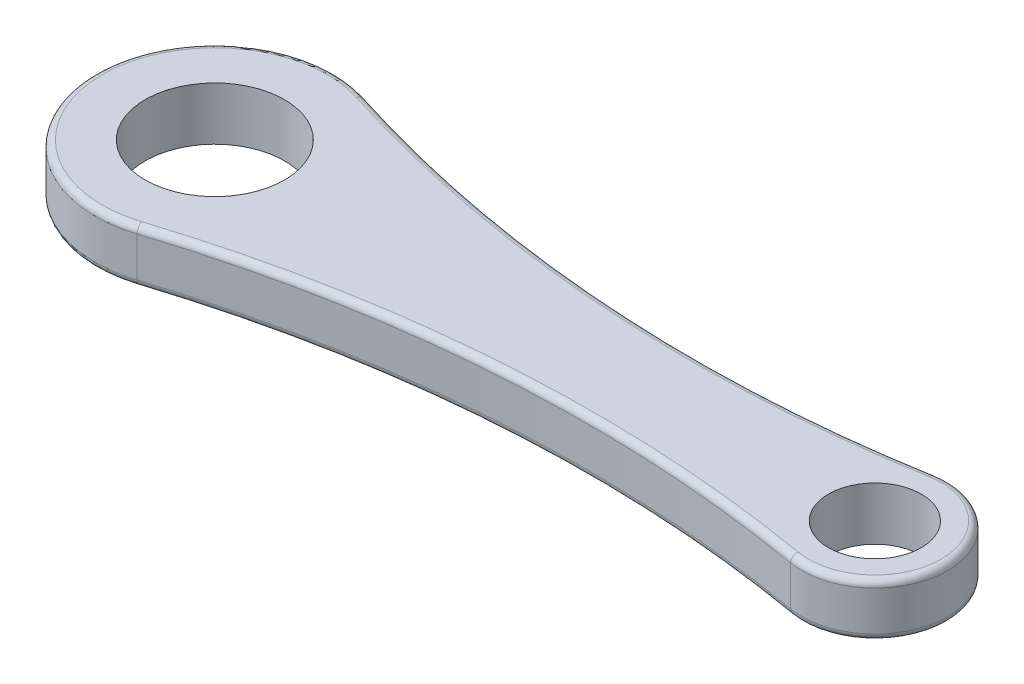
ISO-10303-21;
HEADER;
FILE_DESCRIPTION(('STEP AP214'),'2;1');
FILE_NAME('part.step','',(''),(''),'','','');
FILE_SCHEMA(('AUTOMOTIVE_DESIGN { 1 0 10303 214 1 1 1 1 }'));
ENDSEC;
DATA;
#1=APPLICATION_CONTEXT('core data for automotive mechanical design processes');
#2=APPLICATION_PROTOCOL_DEFINITION('international standard','automotive_design',2000,#1);
#3=PRODUCT_CONTEXT('',#1,'mechanical');
#4=PRODUCT('Part','Part','',(#3));
#5=PRODUCT_RELATED_PRODUCT_CATEGORY('part','',(#4));
#6=PRODUCT_DEFINITION_FORMATION('','',#4);
#7=PRODUCT_DEFINITION_CONTEXT('part definition',#1,'design');
#8=PRODUCT_DEFINITION('design','',#6,#7);
#9=PRODUCT_DEFINITION_SHAPE('','',#8);
#10=(LENGTH_UNIT() NAMED_UNIT(*) SI_UNIT(.MILLI.,.METRE.));
#11=(NAMED_UNIT(*) PLANE_ANGLE_UNIT() SI_UNIT($,.RADIAN.));
#12=(NAMED_UNIT(*) SI_UNIT($,.STERADIAN.) SOLID_ANGLE_UNIT());
#13=UNCERTAINTY_MEASURE_WITH_UNIT(LENGTH_MEASURE(1.E-05),#10,'distance_accuracy_value','');
#14=(GEOMETRIC_REPRESENTATION_CONTEXT(3) GLOBAL_UNCERTAINTY_ASSIGNED_CONTEXT((#13)) GLOBAL_UNIT_ASSIGNED_CONTEXT((#10,
#11,#12)) REPRESENTATION_CONTEXT('',''));
#15=CARTESIAN_POINT('',(0.,0.,0.));
#16=DIRECTION('',(0.,0.,1.));
#17=DIRECTION('',(1.,0.,0.));
#18=AXIS2_PLACEMENT_3D('',#15,#16,#17);
#19=CARTESIAN_POINT('',(40.9952282774071,4.00000000000001,-50.7223519431426));
#20=DIRECTION('',(0.,1.,0.));
#21=DIRECTION('',(0.,0.,1.));
#22=AXIS2_PLACEMENT_3D('',#19,#20,#21);
#23=PLANE('',#22);
#24=CARTESIAN_POINT('',(32.2404565548141,3.99999999999999,-101.444703886285));
#25=DIRECTION('',(0.,1.,0.));
#26=DIRECTION('',(0.,0.,1.));
#27=AXIS2_PLACEMENT_3D('',#24,#25,#26);
#28=CIRCLE('',#27,97.9447038862851);
#29=CARTESIAN_POINT('',(48.8995656024944,3.99999999999995,-4.92714535360375));
#30=VERTEX_POINT('',#29);
#31=CARTESIAN_POINT('',(2.5745187004201,4.00000000000001,-8.10073166209001));
#32=VERTEX_POINT('',#31);
#33=EDGE_CURVE('E51',#30,#32,#28,.F.);
#34=ORIENTED_EDGE('',*,*,#33,.T.);
#35=CARTESIAN_POINT('',(0.,4.00000000000002,0.));
#36=DIRECTION('',(0.,1.,0.));
#37=DIRECTION('',(0.,0.,1.));
#38=AXIS2_PLACEMENT_3D('',#35,#36,#37);
#39=CIRCLE('',#38,8.49999999999999);
#40=CARTESIAN_POINT('',(2.57451870042005,4.,8.10073166209));
#41=VERTEX_POINT('',#40);
#42=EDGE_CURVE('E110',#32,#41,#39,.T.);
#43=ORIENTED_EDGE('',*,*,#42,.T.);
#44=CARTESIAN_POINT('',(32.2404565548141,4.00000000000003,101.444703886285));
#45=DIRECTION('',(0.,1.,0.));
#46=DIRECTION('',(0.,0.,1.));
#47=AXIS2_PLACEMENT_3D('',#44,#45,#46);
#48=CIRCLE('',#47,97.9447038862851);
#49=CARTESIAN_POINT('',(48.8995656024944,3.99999999999999,4.92714535360378));
#50=VERTEX_POINT('',#49);
#51=EDGE_CURVE('E133',#41,#50,#48,.F.);
#52=ORIENTED_EDGE('',*,*,#51,.T.);
#53=CARTESIAN_POINT('',(49.75,4.,0.));
#54=DIRECTION('',(0.,1.,0.));
#55=DIRECTION('',(0.,0.,1.));
#56=AXIS2_PLACEMENT_3D('',#53,#54,#55);
#57=CIRCLE('',#56,4.99999999999999);
#58=EDGE_CURVE('E56',#50,#30,#57,.T.);
#59=ORIENTED_EDGE('',*,*,#58,.T.);
#60=EDGE_LOOP('',(#34,#43,#52,#59));
#61=FACE_BOUND('',#60,.T.);
#62=CARTESIAN_POINT('',(0.,4.00000000000002,0.));
#63=DIRECTION('',(0.,1.,0.));
#64=DIRECTION('',(0.,0.,1.));
#65=AXIS2_PLACEMENT_3D('',#62,#63,#64);
#66=CIRCLE('',#65,5.25);
#67=CARTESIAN_POINT('',(0.,4.00000000000002,5.24999999999999));
#68=VERTEX_POINT('',#67);
#69=EDGE_CURVE('E170',#68,#68,#66,.T.);
#70=ORIENTED_EDGE('',*,*,#69,.F.);
#71=EDGE_LOOP('',(#70));
#72=FACE_BOUND('',#71,.T.);
#73=CARTESIAN_POINT('',(49.75,4.,0.));
#74=DIRECTION('',(0.,1.,0.));
#75=DIRECTION('',(0.,0.,1.));
#76=AXIS2_PLACEMENT_3D('',#73,#74,#75);
#77=CIRCLE('',#76,3.5);
#78=CARTESIAN_POINT('',(49.75,4.,3.5));
#79=VERTEX_POINT('',#78);
#80=EDGE_CURVE('E162',#79,#79,#77,.T.);
#81=ORIENTED_EDGE('',*,*,#80,.F.);
#82=EDGE_LOOP('',(#81));
#83=FACE_BOUND('',#82,.T.);
#84=ADVANCED_FACE('F34',(#61,#72,#83),#23,.T.);
#85=CARTESIAN_POINT('',(40.9952282774071,0.,-50.7223519431426));
#86=DIRECTION('',(0.,1.,0.));
#87=DIRECTION('',(0.,0.,1.));
#88=AXIS2_PLACEMENT_3D('',#85,#86,#87);
#89=PLANE('',#88);
#90=CARTESIAN_POINT('',(32.240456554814,0.,101.444703886285));
#91=DIRECTION('',(0.,1.,0.));
#92=DIRECTION('',(0.,0.,1.));
#93=AXIS2_PLACEMENT_3D('',#90,#91,#92);
#94=CIRCLE('',#93,97.9447038862851);
#95=CARTESIAN_POINT('',(48.8995656024944,0.,4.92714535360375));
#96=VERTEX_POINT('',#95);
#97=CARTESIAN_POINT('',(2.57451870042005,0.,8.10073166208999));
#98=VERTEX_POINT('',#97);
#99=EDGE_CURVE('E181',#96,#98,#94,.T.);
#100=ORIENTED_EDGE('',*,*,#99,.T.);
#101=CARTESIAN_POINT('',(0.,0.,0.));
#102=DIRECTION('',(0.,1.,0.));
#103=DIRECTION('',(0.,0.,1.));
#104=AXIS2_PLACEMENT_3D('',#101,#102,#103);
#105=CIRCLE('',#104,8.49999999999999);
#106=CARTESIAN_POINT('',(2.57451870042007,0.,-8.10073166208999));
#107=VERTEX_POINT('',#106);
#108=EDGE_CURVE('E187',#98,#107,#105,.F.);
#109=ORIENTED_EDGE('',*,*,#108,.T.);
#110=CARTESIAN_POINT('',(32.2404565548141,0.,-101.444703886285));
#111=DIRECTION('',(0.,1.,0.));
#112=DIRECTION('',(0.,0.,1.));
#113=AXIS2_PLACEMENT_3D('',#110,#111,#112);
#114=CIRCLE('',#113,97.9447038862851);
#115=CARTESIAN_POINT('',(48.8995656024944,0.,-4.92714535360379));
#116=VERTEX_POINT('',#115);
#117=EDGE_CURVE('E185',#107,#116,#114,.T.);
#118=ORIENTED_EDGE('',*,*,#117,.T.);
#119=CARTESIAN_POINT('',(49.75,0.,0.));
#120=DIRECTION('',(0.,1.,0.));
#121=DIRECTION('',(0.,0.,1.));
#122=AXIS2_PLACEMENT_3D('',#119,#120,#121);
#123=CIRCLE('',#122,4.99999999999999);
#124=EDGE_CURVE('E183',#116,#96,#123,.F.);
#125=ORIENTED_EDGE('',*,*,#124,.T.);
#126=EDGE_LOOP('',(#100,#109,#118,#125));
#127=FACE_BOUND('',#126,.T.);
#128=CARTESIAN_POINT('',(0.,0.,0.));
#129=DIRECTION('',(0.,1.,0.));
#130=DIRECTION('',(0.,0.,1.));
#131=AXIS2_PLACEMENT_3D('',#128,#129,#130);
#132=CIRCLE('',#131,5.25);
#133=CARTESIAN_POINT('',(0.,0.,5.25));
#134=VERTEX_POINT('',#133);
#135=EDGE_CURVE('E167',#134,#134,#132,.T.);
#136=ORIENTED_EDGE('',*,*,#135,.T.);
#137=EDGE_LOOP('',(#136));
#138=FACE_BOUND('',#137,.T.);
#139=CARTESIAN_POINT('',(49.75,0.,0.));
#140=DIRECTION('',(0.,1.,0.));
#141=DIRECTION('',(0.,0.,1.));
#142=AXIS2_PLACEMENT_3D('',#139,#140,#141);
#143=CIRCLE('',#142,3.5);
#144=CARTESIAN_POINT('',(49.75,0.,3.49999999999999));
#145=VERTEX_POINT('',#144);
#146=EDGE_CURVE('E156',#145,#145,#143,.T.);
#147=ORIENTED_EDGE('',*,*,#146,.T.);
#148=EDGE_LOOP('',(#147));
#149=FACE_BOUND('',#148,.T.);
#150=ADVANCED_FACE('F227',(#127,#138,#149),#89,.F.);
#151=CARTESIAN_POINT('',(32.2404565548141,3.99999999999999,-101.444703886285));
#152=DIRECTION('',(0.,-1.,0.));
#153=DIRECTION('',(0.,0.,-1.));
#154=AXIS2_PLACEMENT_3D('',#151,#152,#153);
#155=CYLINDRICAL_SURFACE('',#154,97.4447038862851);
#156=DIRECTION('',(0.,-1.,0.));
#157=VECTOR('',#156,1.);
#158=CARTESIAN_POINT('',(48.8145221627438,3.99999999999999,-5.41985988896414));
#159=LINE('',#158,#157);
#160=CARTESIAN_POINT('',(48.8145221627439,3.49999999999996,-5.41985988896416));
#161=VERTEX_POINT('',#160);
#162=CARTESIAN_POINT('',(48.8145221627439,0.499999999999969,-5.41985988896414));
#163=VERTEX_POINT('',#162);
#164=EDGE_CURVE('E173',#161,#163,#159,.T.);
#165=ORIENTED_EDGE('',*,*,#164,.T.);
#166=CARTESIAN_POINT('',(32.2404565548141,0.499999999999976,-101.444703886285));
#167=DIRECTION('',(0.,1.,0.));
#168=DIRECTION('',(0.,0.,1.));
#169=AXIS2_PLACEMENT_3D('',#166,#167,#168);
#170=CIRCLE('',#169,97.4447038862851);
#171=CARTESIAN_POINT('',(2.72596097691541,0.499999999999997,-8.57724528927175));
#172=VERTEX_POINT('',#171);
#173=EDGE_CURVE('E192',#163,#172,#170,.F.);
#174=ORIENTED_EDGE('',*,*,#173,.T.);
#175=DIRECTION('',(0.,-1.,0.));
#176=VECTOR('',#175,1.);
#177=CARTESIAN_POINT('',(2.72596097691538,4.,-8.57724528927178));
#178=LINE('',#177,#176);
#179=CARTESIAN_POINT('',(2.7259609769154,3.50000000000002,-8.57724528927175));
#180=VERTEX_POINT('',#179);
#181=EDGE_CURVE('E122',#180,#172,#178,.T.);
#182=ORIENTED_EDGE('',*,*,#181,.F.);
#183=CARTESIAN_POINT('',(32.2404565548141,3.5,-101.444703886285));
#184=DIRECTION('',(0.,1.,0.));
#185=DIRECTION('',(0.,0.,1.));
#186=AXIS2_PLACEMENT_3D('',#183,#184,#185);
#187=CIRCLE('',#186,97.4447038862851);
#188=EDGE_CURVE('E190',#180,#161,#187,.T.);
#189=ORIENTED_EDGE('',*,*,#188,.T.);
#190=EDGE_LOOP('',(#165,#174,#182,#189));
#191=FACE_BOUND('',#190,.T.);
#192=ADVANCED_FACE('F207',(#191),#155,.F.);
#193=CARTESIAN_POINT('',(0.,4.00000000000002,0.));
#194=DIRECTION('',(0.,-1.,0.));
#195=DIRECTION('',(0.,0.,-1.));
#196=AXIS2_PLACEMENT_3D('',#193,#194,#195);
#197=CYLINDRICAL_SURFACE('',#196,8.99999999999999);
#198=ORIENTED_EDGE('',*,*,#181,.T.);
#199=CARTESIAN_POINT('',(0.,0.499999999999997,0.));
#200=DIRECTION('',(0.,1.,0.));
#201=DIRECTION('',(0.,0.,1.));
#202=AXIS2_PLACEMENT_3D('',#199,#200,#201);
#203=CIRCLE('',#202,8.99999999999999);
#204=CARTESIAN_POINT('',(2.72596097691537,0.499999999999997,8.57724528927175));
#205=VERTEX_POINT('',#204);
#206=EDGE_CURVE('E121',#172,#205,#203,.T.);
#207=ORIENTED_EDGE('',*,*,#206,.T.);
#208=DIRECTION('',(0.,-1.,0.));
#209=VECTOR('',#208,1.);
#210=CARTESIAN_POINT('',(2.72596097691537,4.00000000000001,8.57724528927175));
#211=LINE('',#210,#209);
#212=CARTESIAN_POINT('',(2.72596097691535,3.5,8.57724528927176));
#213=VERTEX_POINT('',#212);
#214=EDGE_CURVE('E103',#213,#205,#211,.T.);
#215=ORIENTED_EDGE('',*,*,#214,.F.);
#216=CARTESIAN_POINT('',(0.,3.49999999999999,0.));
#217=DIRECTION('',(0.,1.,0.));
#218=DIRECTION('',(0.,0.,1.));
#219=AXIS2_PLACEMENT_3D('',#216,#217,#218);
#220=CIRCLE('',#219,8.99999999999999);
#221=EDGE_CURVE('E118',#213,#180,#220,.F.);
#222=ORIENTED_EDGE('',*,*,#221,.T.);
#223=EDGE_LOOP('',(#198,#207,#215,#222));
#224=FACE_BOUND('',#223,.T.);
#225=ADVANCED_FACE('F117',(#224),#197,.T.);
#226=CARTESIAN_POINT('',(32.2404565548141,4.00000000000003,101.444703886285));
#227=DIRECTION('',(0.,-1.,0.));
#228=DIRECTION('',(0.,0.,-1.));
#229=AXIS2_PLACEMENT_3D('',#226,#227,#228);
#230=CYLINDRICAL_SURFACE('',#229,97.4447038862851);
#231=ORIENTED_EDGE('',*,*,#214,.T.);
#232=CARTESIAN_POINT('',(32.240456554814,0.500000000000011,101.444703886285));
#233=DIRECTION('',(0.,1.,0.));
#234=DIRECTION('',(0.,0.,1.));
#235=AXIS2_PLACEMENT_3D('',#232,#233,#234);
#236=CIRCLE('',#235,97.4447038862851);
#237=CARTESIAN_POINT('',(48.8145221627439,0.499999999999997,5.41985988896414));
#238=VERTEX_POINT('',#237);
#239=EDGE_CURVE('E11',#205,#238,#236,.F.);
#240=ORIENTED_EDGE('',*,*,#239,.T.);
#241=DIRECTION('',(0.,-1.,0.));
#242=VECTOR('',#241,1.);
#243=CARTESIAN_POINT('',(48.8145221627439,4.00000000000002,5.41985988896414));
#244=LINE('',#243,#242);
#245=CARTESIAN_POINT('',(48.8145221627438,3.5,5.41985988896414));
#246=VERTEX_POINT('',#245);
#247=EDGE_CURVE('E105',#246,#238,#244,.T.);
#248=ORIENTED_EDGE('',*,*,#247,.F.);
#249=CARTESIAN_POINT('',(32.2404565548141,3.50000000000001,101.444703886285));
#250=DIRECTION('',(0.,1.,0.));
#251=DIRECTION('',(0.,0.,1.));
#252=AXIS2_PLACEMENT_3D('',#249,#250,#251);
#253=CIRCLE('',#252,97.4447038862851);
#254=EDGE_CURVE('E43',#246,#213,#253,.T.);
#255=ORIENTED_EDGE('',*,*,#254,.T.);
#256=EDGE_LOOP('',(#231,#240,#248,#255));
#257=FACE_BOUND('',#256,.T.);
#258=ADVANCED_FACE('F102',(#257),#230,.F.);
#259=CARTESIAN_POINT('',(49.75,4.,0.));
#260=DIRECTION('',(0.,-1.,0.));
#261=DIRECTION('',(0.,0.,-1.));
#262=AXIS2_PLACEMENT_3D('',#259,#260,#261);
#263=CYLINDRICAL_SURFACE('',#262,5.49999999999999);
#264=ORIENTED_EDGE('',*,*,#247,.T.);
#265=CARTESIAN_POINT('',(49.7500000000001,0.499999999999969,0.));
#266=DIRECTION('',(0.,1.,0.));
#267=DIRECTION('',(0.,0.,1.));
#268=AXIS2_PLACEMENT_3D('',#265,#266,#267);
#269=CIRCLE('',#268,5.49999999999999);
#270=EDGE_CURVE('E196',#238,#163,#269,.T.);
#271=ORIENTED_EDGE('',*,*,#270,.T.);
#272=ORIENTED_EDGE('',*,*,#164,.F.);
#273=CARTESIAN_POINT('',(49.75,3.49999999999999,0.));
#274=DIRECTION('',(0.,1.,0.));
#275=DIRECTION('',(0.,0.,1.));
#276=AXIS2_PLACEMENT_3D('',#273,#274,#275);
#277=CIRCLE('',#276,5.49999999999999);
#278=EDGE_CURVE('E194',#161,#246,#277,.F.);
#279=ORIENTED_EDGE('',*,*,#278,.T.);
#280=EDGE_LOOP('',(#264,#271,#272,#279));
#281=FACE_BOUND('',#280,.T.);
#282=ADVANCED_FACE('F209',(#281),#263,.T.);
#283=CARTESIAN_POINT('',(0.,4.00000000000002,0.));
#284=DIRECTION('',(0.,-1.,0.));
#285=DIRECTION('',(0.,0.,-1.));
#286=AXIS2_PLACEMENT_3D('',#283,#284,#285);
#287=CYLINDRICAL_SURFACE('',#286,5.25);
#288=ORIENTED_EDGE('',*,*,#69,.T.);
#289=EDGE_LOOP('',(#288));
#290=FACE_BOUND('',#289,.T.);
#291=ORIENTED_EDGE('',*,*,#135,.F.);
#292=EDGE_LOOP('',(#291));
#293=FACE_BOUND('',#292,.T.);
#294=ADVANCED_FACE('F235',(#290,#293),#287,.F.);
#295=CARTESIAN_POINT('',(49.75,4.,0.));
#296=DIRECTION('',(0.,-1.,0.));
#297=DIRECTION('',(0.,0.,-1.));
#298=AXIS2_PLACEMENT_3D('',#295,#296,#297);
#299=CYLINDRICAL_SURFACE('',#298,3.5);
#300=ORIENTED_EDGE('',*,*,#80,.T.);
#301=EDGE_LOOP('',(#300));
#302=FACE_BOUND('',#301,.T.);
#303=ORIENTED_EDGE('',*,*,#146,.F.);
#304=EDGE_LOOP('',(#303));
#305=FACE_BOUND('',#304,.T.);
#306=ADVANCED_FACE('F266',(#302,#305),#299,.F.);
#307=CARTESIAN_POINT('',(49.7500000000001,0.499999999999969,0.));
#308=DIRECTION('',(0.,1.,0.));
#309=DIRECTION('',(0.,0.,1.));
#310=AXIS2_PLACEMENT_3D('',#307,#308,#309);
#311=TOROIDAL_SURFACE('',#310,4.99999999999999,0.5);
#312=CARTESIAN_POINT('',(48.8995656024944,0.49999999999999,4.92714535360377));
#313=DIRECTION('',(-0.985429070720756,0.,-0.170086879501125));
#314=DIRECTION('',(-0.170086879501125,0.,0.985429070720755));
#315=AXIS2_PLACEMENT_3D('',#312,#313,#314);
#316=CIRCLE('',#315,0.5);
#317=EDGE_CURVE('E149',#96,#238,#316,.T.);
#318=ORIENTED_EDGE('',*,*,#317,.F.);
#319=ORIENTED_EDGE('',*,*,#124,.F.);
#320=CARTESIAN_POINT('',(48.8995656024944,0.499999999999983,-4.92714535360377));
#321=DIRECTION('',(-0.985429070720755,0.,0.170086879501125));
#322=DIRECTION('',(0.170086879501125,0.,0.985429070720755));
#323=AXIS2_PLACEMENT_3D('',#320,#321,#322);
#324=CIRCLE('',#323,0.5);
#325=EDGE_CURVE('E138',#163,#116,#324,.T.);
#326=ORIENTED_EDGE('',*,*,#325,.F.);
#327=ORIENTED_EDGE('',*,*,#270,.F.);
#328=EDGE_LOOP('',(#318,#319,#326,#327));
#329=FACE_BOUND('',#328,.T.);
#330=ADVANCED_FACE('F212',(#329),#311,.T.);
#331=CARTESIAN_POINT('',(32.2404565548141,0.499999999999976,-101.444703886285));
#332=DIRECTION('',(0.,1.,0.));
#333=DIRECTION('',(0.,0.,1.));
#334=AXIS2_PLACEMENT_3D('',#331,#332,#333);
#335=TOROIDAL_SURFACE('',#334,97.9447038862851,0.5);
#336=ORIENTED_EDGE('',*,*,#325,.T.);
#337=ORIENTED_EDGE('',*,*,#117,.F.);
#338=CARTESIAN_POINT('',(2.57451870042009,0.500000000000011,-8.10073166209001));
#339=DIRECTION('',(-0.953027254363529,0.,-0.302884552990599));
#340=DIRECTION('',(-0.302884552990599,0.,0.953027254363529));
#341=AXIS2_PLACEMENT_3D('',#338,#339,#340);
#342=CIRCLE('',#341,0.5);
#343=EDGE_CURVE('E143',#172,#107,#342,.T.);
#344=ORIENTED_EDGE('',*,*,#343,.F.);
#345=ORIENTED_EDGE('',*,*,#173,.F.);
#346=EDGE_LOOP('',(#336,#337,#344,#345));
#347=FACE_BOUND('',#346,.T.);
#348=ADVANCED_FACE('F215',(#347),#335,.T.);
#349=CARTESIAN_POINT('',(32.240456554814,0.500000000000011,101.444703886285));
#350=DIRECTION('',(0.,1.,0.));
#351=DIRECTION('',(0.,0.,1.));
#352=AXIS2_PLACEMENT_3D('',#349,#350,#351);
#353=TOROIDAL_SURFACE('',#352,97.9447038862851,0.5);
#354=ORIENTED_EDGE('',*,*,#317,.T.);
#355=ORIENTED_EDGE('',*,*,#239,.F.);
#356=CARTESIAN_POINT('',(2.57451870042007,0.500000000000032,8.10073166209001));
#357=DIRECTION('',(-0.953027254363531,0.,0.302884552990595));
#358=DIRECTION('',(0.302884552990596,0.,0.95302725436353));
#359=AXIS2_PLACEMENT_3D('',#356,#357,#358);
#360=CIRCLE('',#359,0.5);
#361=EDGE_CURVE('E141',#98,#205,#360,.T.);
#362=ORIENTED_EDGE('',*,*,#361,.F.);
#363=ORIENTED_EDGE('',*,*,#99,.F.);
#364=EDGE_LOOP('',(#354,#355,#362,#363));
#365=FACE_BOUND('',#364,.T.);
#366=ADVANCED_FACE('F218',(#365),#353,.T.);
#367=CARTESIAN_POINT('',(0.,0.499999999999997,0.));
#368=DIRECTION('',(0.,1.,0.));
#369=DIRECTION('',(0.,0.,1.));
#370=AXIS2_PLACEMENT_3D('',#367,#368,#369);
#371=TOROIDAL_SURFACE('',#370,8.49999999999999,0.5);
#372=ORIENTED_EDGE('',*,*,#343,.T.);
#373=ORIENTED_EDGE('',*,*,#108,.F.);
#374=ORIENTED_EDGE('',*,*,#361,.T.);
#375=ORIENTED_EDGE('',*,*,#206,.F.);
#376=EDGE_LOOP('',(#372,#373,#374,#375));
#377=FACE_BOUND('',#376,.T.);
#378=ADVANCED_FACE('F216',(#377),#371,.T.);
#379=CARTESIAN_POINT('',(49.75,3.49999999999999,0.));
#380=DIRECTION('',(0.,1.,0.));
#381=DIRECTION('',(0.,0.,1.));
#382=AXIS2_PLACEMENT_3D('',#379,#380,#381);
#383=TOROIDAL_SURFACE('',#382,4.99999999999999,0.5);
#384=CARTESIAN_POINT('',(48.8995656024943,3.5,4.92714535360377));
#385=DIRECTION('',(-0.985429070720755,0.,-0.170086879501125));
#386=DIRECTION('',(-0.170086879501125,0.,0.985429070720755));
#387=AXIS2_PLACEMENT_3D('',#384,#385,#386);
#388=CIRCLE('',#387,0.5);
#389=EDGE_CURVE('E135',#246,#50,#388,.T.);
#390=ORIENTED_EDGE('',*,*,#389,.F.);
#391=ORIENTED_EDGE('',*,*,#278,.F.);
#392=CARTESIAN_POINT('',(48.8995656024944,3.49999999999999,-4.92714535360377));
#393=DIRECTION('',(-0.985429070720755,0.,0.170086879501124));
#394=DIRECTION('',(0.170086879501125,0.,0.985429070720755));
#395=AXIS2_PLACEMENT_3D('',#392,#393,#394);
#396=CIRCLE('',#395,0.5);
#397=EDGE_CURVE('E38',#30,#161,#396,.T.);
#398=ORIENTED_EDGE('',*,*,#397,.F.);
#399=ORIENTED_EDGE('',*,*,#58,.F.);
#400=EDGE_LOOP('',(#390,#391,#398,#399));
#401=FACE_BOUND('',#400,.T.);
#402=ADVANCED_FACE('F36',(#401),#383,.T.);
#403=CARTESIAN_POINT('',(32.2404565548141,3.5,-101.444703886285));
#404=DIRECTION('',(0.,1.,0.));
#405=DIRECTION('',(0.,0.,1.));
#406=AXIS2_PLACEMENT_3D('',#403,#404,#405);
#407=TOROIDAL_SURFACE('',#406,97.9447038862851,0.5);
#408=ORIENTED_EDGE('',*,*,#397,.T.);
#409=ORIENTED_EDGE('',*,*,#188,.F.);
#410=CARTESIAN_POINT('',(2.5745187004201,3.50000000000001,-8.10073166209));
#411=DIRECTION('',(-0.95302725436353,0.,-0.302884552990597));
#412=DIRECTION('',(-0.302884552990598,0.,0.953027254363529));
#413=AXIS2_PLACEMENT_3D('',#410,#411,#412);
#414=CIRCLE('',#413,0.5);
#415=EDGE_CURVE('E129',#32,#180,#414,.T.);
#416=ORIENTED_EDGE('',*,*,#415,.F.);
#417=ORIENTED_EDGE('',*,*,#33,.F.);
#418=EDGE_LOOP('',(#408,#409,#416,#417));
#419=FACE_BOUND('',#418,.T.);
#420=ADVANCED_FACE('F204',(#419),#407,.T.);
#421=CARTESIAN_POINT('',(32.2404565548141,3.50000000000001,101.444703886285));
#422=DIRECTION('',(0.,1.,0.));
#423=DIRECTION('',(0.,0.,1.));
#424=AXIS2_PLACEMENT_3D('',#421,#422,#423);
#425=TOROIDAL_SURFACE('',#424,97.9447038862851,0.5);
#426=ORIENTED_EDGE('',*,*,#389,.T.);
#427=ORIENTED_EDGE('',*,*,#51,.F.);
#428=CARTESIAN_POINT('',(2.57451870042005,3.50000000000001,8.10073166209001));
#429=DIRECTION('',(-0.953027254363529,0.,0.302884552990598));
#430=DIRECTION('',(0.302884552990599,0.,0.953027254363529));
#431=AXIS2_PLACEMENT_3D('',#428,#429,#430);
#432=CIRCLE('',#431,0.5);
#433=EDGE_CURVE('E127',#213,#41,#432,.T.);
#434=ORIENTED_EDGE('',*,*,#433,.F.);
#435=ORIENTED_EDGE('',*,*,#254,.F.);
#436=EDGE_LOOP('',(#426,#427,#434,#435));
#437=FACE_BOUND('',#436,.T.);
#438=ADVANCED_FACE('F132',(#437),#425,.T.);
#439=CARTESIAN_POINT('',(0.,3.49999999999999,0.));
#440=DIRECTION('',(0.,1.,0.));
#441=DIRECTION('',(0.,0.,1.));
#442=AXIS2_PLACEMENT_3D('',#439,#440,#441);
#443=TOROIDAL_SURFACE('',#442,8.49999999999999,0.5);
#444=ORIENTED_EDGE('',*,*,#415,.T.);
#445=ORIENTED_EDGE('',*,*,#221,.F.);
#446=ORIENTED_EDGE('',*,*,#433,.T.);
#447=ORIENTED_EDGE('',*,*,#42,.F.);
#448=EDGE_LOOP('',(#444,#445,#446,#447));
#449=FACE_BOUND('',#448,.T.);
#450=ADVANCED_FACE('F125',(#449),#443,.T.);
#451=CLOSED_SHELL('',(#84,#150,#192,#225,#258,#282,#294,#306,#330,#348,#366,#378,#402,#420,#438,#450));
#452=MANIFOLD_SOLID_BREP('B2',#451);
#453=ADVANCED_BREP_SHAPE_REPRESENTATION('',(#18,#452),#14);
#454=SHAPE_DEFINITION_REPRESENTATION(#9,#453);
ENDSEC;
END-ISO-10303-21;
